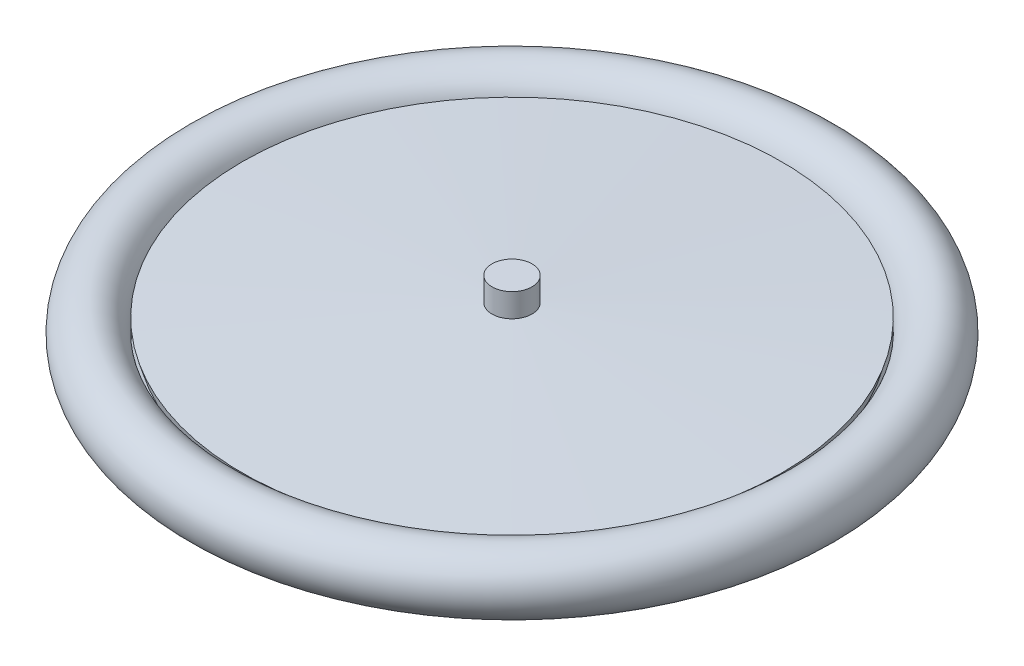
ISO-10303-21;
HEADER;
FILE_DESCRIPTION(('STEP AP214'),'2;1');
FILE_NAME('part.step','',(''),(''),'','','');
FILE_SCHEMA(('AUTOMOTIVE_DESIGN { 1 0 10303 214 1 1 1 1 }'));
ENDSEC;
DATA;
#1=APPLICATION_CONTEXT('core data for automotive mechanical design processes');
#2=APPLICATION_PROTOCOL_DEFINITION('international standard','automotive_design',2000,#1);
#3=PRODUCT_CONTEXT('',#1,'mechanical');
#4=PRODUCT('Part','Part','',(#3));
#5=PRODUCT_RELATED_PRODUCT_CATEGORY('part','',(#4));
#6=PRODUCT_DEFINITION_FORMATION('','',#4);
#7=PRODUCT_DEFINITION_CONTEXT('part definition',#1,'design');
#8=PRODUCT_DEFINITION('design','',#6,#7);
#9=PRODUCT_DEFINITION_SHAPE('','',#8);
#10=(LENGTH_UNIT() NAMED_UNIT(*) SI_UNIT(.MILLI.,.METRE.));
#11=(NAMED_UNIT(*) PLANE_ANGLE_UNIT() SI_UNIT($,.RADIAN.));
#12=(NAMED_UNIT(*) SI_UNIT($,.STERADIAN.) SOLID_ANGLE_UNIT());
#13=UNCERTAINTY_MEASURE_WITH_UNIT(LENGTH_MEASURE(1.E-05),#10,'distance_accuracy_value','');
#14=(GEOMETRIC_REPRESENTATION_CONTEXT(3) GLOBAL_UNCERTAINTY_ASSIGNED_CONTEXT((#13)) GLOBAL_UNIT_ASSIGNED_CONTEXT((#10,
#11,#12)) REPRESENTATION_CONTEXT('',''));
#15=CARTESIAN_POINT('',(0.,0.,0.));
#16=DIRECTION('',(0.,0.,1.));
#17=DIRECTION('',(1.,0.,0.));
#18=AXIS2_PLACEMENT_3D('',#15,#16,#17);
#19=CARTESIAN_POINT('',(0.,25.,0.));
#20=DIRECTION('',(0.,-1.,0.));
#21=DIRECTION('',(1.,0.,0.));
#22=AXIS2_PLACEMENT_3D('',#19,#20,#21);
#23=TOROIDAL_SURFACE('',#22,150.,15.);
#24=CARTESIAN_POINT('',(165.,25.,0.));
#25=VERTEX_POINT('',#24);
#26=VERTEX_LOOP('',#25);
#27=FACE_BOUND('',#26,.T.);
#28=ADVANCED_FACE('F39',(#27),#23,.T.);
#29=CLOSED_SHELL('',(#28));
#30=MANIFOLD_SOLID_BREP('B2',#29);
#31=CARTESIAN_POINT('',(0.,50.,0.));
#32=DIRECTION('',(0.,1.,0.));
#33=DIRECTION('',(-1.,0.,0.));
#34=AXIS2_PLACEMENT_3D('',#31,#32,#33);
#35=PLANE('',#34);
#36=CARTESIAN_POINT('',(0.,50.,0.));
#37=DIRECTION('',(0.,-1.,0.));
#38=DIRECTION('',(1.,0.,0.));
#39=AXIS2_PLACEMENT_3D('',#36,#37,#38);
#40=CIRCLE('',#39,10.);
#41=CARTESIAN_POINT('',(10.,50.,0.));
#42=VERTEX_POINT('',#41);
#43=EDGE_CURVE('E38',#42,#42,#40,.T.);
#44=ORIENTED_EDGE('',*,*,#43,.F.);
#45=EDGE_LOOP('',(#44));
#46=FACE_BOUND('',#45,.T.);
#47=ADVANCED_FACE('F54',(#46),#35,.T.);
#48=CARTESIAN_POINT('',(0.,0.,0.));
#49=DIRECTION('',(0.,-1.,0.));
#50=DIRECTION('',(1.,0.,0.));
#51=AXIS2_PLACEMENT_3D('',#48,#49,#50);
#52=CYLINDRICAL_SURFACE('',#51,10.);
#53=ORIENTED_EDGE('',*,*,#43,.T.);
#54=EDGE_LOOP('',(#53));
#55=FACE_BOUND('',#54,.T.);
#56=CARTESIAN_POINT('',(0.,38.1924821691245,0.));
#57=DIRECTION('',(0.,-1.,0.));
#58=DIRECTION('',(1.,0.,0.));
#59=AXIS2_PLACEMENT_3D('',#56,#57,#58);
#60=CIRCLE('',#59,10.);
#61=CARTESIAN_POINT('',(9.99999999999995,38.1924821691245,0.));
#62=VERTEX_POINT('',#61);
#63=EDGE_CURVE('E60',#62,#62,#60,.T.);
#64=ORIENTED_EDGE('',*,*,#63,.F.);
#65=EDGE_LOOP('',(#64));
#66=FACE_BOUND('',#65,.T.);
#67=ADVANCED_FACE('F99',(#55,#66),#52,.T.);
#68=CARTESIAN_POINT('',(0.,31.7927249202587,0.));
#69=DIRECTION('',(0.,-1.,0.));
#70=DIRECTION('',(1.,0.,0.));
#71=AXIS2_PLACEMENT_3D('',#68,#69,#70);
#72=CONICAL_SURFACE('',#71,135.,1.51964293273203);
#73=CARTESIAN_POINT('',(0.,31.7927249202587,0.));
#74=DIRECTION('',(0.,-1.,0.));
#75=DIRECTION('',(1.,0.,0.));
#76=AXIS2_PLACEMENT_3D('',#73,#74,#75);
#77=CIRCLE('',#76,135.);
#78=CARTESIAN_POINT('',(135.,31.7927249202588,0.));
#79=VERTEX_POINT('',#78);
#80=EDGE_CURVE('E64',#79,#79,#77,.T.);
#81=CARTESIAN_POINT('',(9.99999999999995,38.1924821691245,0.));
#82=CARTESIAN_POINT('',(11.3020833333333,38.1258180311155,0.));
#83=CARTESIAN_POINT('',(12.6041666666666,38.0591538931065,0.));
#84=CARTESIAN_POINT('',(15.2083333333333,37.9258256170884,0.));
#85=CARTESIAN_POINT('',(16.5104166666666,37.8591614790794,0.));
#86=CARTESIAN_POINT('',(19.1145833333333,37.7258332030614,0.));
#87=CARTESIAN_POINT('',(20.4166666666666,37.6591690650524,0.));
#88=CARTESIAN_POINT('',(23.0208333333333,37.5258407890343,0.));
#89=CARTESIAN_POINT('',(24.3229166666666,37.4591766510253,0.));
#90=CARTESIAN_POINT('',(26.9270833333333,37.3258483750073,0.));
#91=CARTESIAN_POINT('',(28.2291666666666,37.2591842369983,0.));
#92=CARTESIAN_POINT('',(30.8333333333333,37.1258559609802,0.));
#93=CARTESIAN_POINT('',(32.1354166666666,37.0591918229712,0.));
#94=CARTESIAN_POINT('',(34.7395833333333,36.9258635469532,0.));
#95=CARTESIAN_POINT('',(36.0416666666666,36.8591994089442,0.));
#96=CARTESIAN_POINT('',(38.6458333333333,36.7258711329261,0.));
#97=CARTESIAN_POINT('',(39.9479166666666,36.6592069949171,0.));
#98=CARTESIAN_POINT('',(42.5520833333333,36.5258787188991,0.));
#99=CARTESIAN_POINT('',(43.8541666666666,36.45921458089,0.));
#100=CARTESIAN_POINT('',(46.4583333333333,36.325886304872,0.));
#101=CARTESIAN_POINT('',(47.7604166666666,36.259222166863,0.));
#102=CARTESIAN_POINT('',(50.3645833333333,36.1258938908449,0.));
#103=CARTESIAN_POINT('',(51.6666666666666,36.0592297528359,0.));
#104=CARTESIAN_POINT('',(54.2708333333333,35.9259014768179,0.));
#105=CARTESIAN_POINT('',(55.5729166666666,35.8592373388089,0.));
#106=CARTESIAN_POINT('',(58.1770833333333,35.7259090627908,0.));
#107=CARTESIAN_POINT('',(59.4791666666666,35.6592449247818,0.));
#108=CARTESIAN_POINT('',(62.0833333333333,35.5259166487638,0.));
#109=CARTESIAN_POINT('',(63.3854166666666,35.4592525107548,0.));
#110=CARTESIAN_POINT('',(65.9895833333333,35.3259242347367,0.));
#111=CARTESIAN_POINT('',(67.2916666666666,35.2592600967277,0.));
#112=CARTESIAN_POINT('',(69.8958333333333,35.1259318207097,0.));
#113=CARTESIAN_POINT('',(71.1979166666666,35.0592676827006,0.));
#114=CARTESIAN_POINT('',(73.8020833333333,34.9259394066826,0.));
#115=CARTESIAN_POINT('',(75.1041666666666,34.8592752686736,0.));
#116=CARTESIAN_POINT('',(77.7083333333333,34.7259469926556,0.));
#117=CARTESIAN_POINT('',(79.0104166666666,34.6592828546465,0.));
#118=CARTESIAN_POINT('',(81.6145833333333,34.5259545786285,0.));
#119=CARTESIAN_POINT('',(82.9166666666666,34.4592904406195,0.));
#120=CARTESIAN_POINT('',(85.5208333333333,34.3259621646015,0.));
#121=CARTESIAN_POINT('',(86.8229166666666,34.2592980265924,0.));
#122=CARTESIAN_POINT('',(89.4270833333333,34.1259697505744,0.));
#123=CARTESIAN_POINT('',(90.7291666666666,34.0593056125654,0.));
#124=CARTESIAN_POINT('',(93.3333333333333,33.9259773365473,0.));
#125=CARTESIAN_POINT('',(94.6354166666666,33.8593131985383,0.));
#126=CARTESIAN_POINT('',(97.2395833333333,33.7259849225203,0.));
#127=CARTESIAN_POINT('',(98.5416666666666,33.6593207845113,0.));
#128=CARTESIAN_POINT('',(101.145833333333,33.5259925084932,0.));
#129=CARTESIAN_POINT('',(102.447916666667,33.4593283704842,0.));
#130=CARTESIAN_POINT('',(105.052083333333,33.3260000944662,0.));
#131=CARTESIAN_POINT('',(106.354166666667,33.2593359564572,0.));
#132=CARTESIAN_POINT('',(108.958333333333,33.1260076804391,0.));
#133=CARTESIAN_POINT('',(110.260416666667,33.0593435424301,0.));
#134=CARTESIAN_POINT('',(112.864583333333,32.9260152664121,0.));
#135=CARTESIAN_POINT('',(114.166666666667,32.859351128403,0.));
#136=CARTESIAN_POINT('',(116.770833333333,32.726022852385,0.));
#137=CARTESIAN_POINT('',(118.072916666667,32.659358714376,0.));
#138=CARTESIAN_POINT('',(120.677083333333,32.526030438358,0.));
#139=CARTESIAN_POINT('',(121.979166666667,32.4593663003489,0.));
#140=CARTESIAN_POINT('',(124.583333333333,32.3260380243309,0.));
#141=CARTESIAN_POINT('',(125.885416666667,32.2593738863219,0.));
#142=CARTESIAN_POINT('',(128.489583333333,32.1260456103039,0.));
#143=CARTESIAN_POINT('',(129.791666666667,32.0593814722948,0.));
#144=CARTESIAN_POINT('',(132.395833333333,31.9260531962768,0.));
#145=CARTESIAN_POINT('',(133.697916666667,31.8593890582678,0.));
#146=CARTESIAN_POINT('',(135.,31.7927249202588,0.));
#147=B_SPLINE_CURVE_WITH_KNOTS('',3,(#81,#82,#83,#84,#85,#86,#87,#88,#89,#90,#91,#92,#93,#94,
#95,#96,#97,#98,#99,#100,#101,#102,#103,#104,#105,#106,#107,#108,#109,#110,#111,#112,#113,#114,
#115,#116,#117,#118,#119,#120,#121,#122,#123,#124,#125,#126,#127,#128,#129,#130,#131,#132,#133,
#134,#135,#136,#137,#138,#139,#140,#141,#142,#143,#144,#145,#146),.UNSPECIFIED.,.F.,.F.,(4,2,2,
2,2,2,2,2,2,2,2,2,2,2,2,2,2,2,2,2,2,2,2,2,2,2,2,2,2,2,2,2,4),(0.,3.91136626106126,
7.82273252212253,11.7340987831838,15.6454650442451,19.5568313053063,23.4681975663676,
27.3795638274289,31.2909300884901,35.2022963495514,39.1136626106126,43.0250288716739,
46.9363951327352,50.8477613937964,54.7591276548577,58.6704939159189,62.5818601769802,
66.4932264380415,70.4045926991027,74.315958960164,78.2273252212253,82.1386914822865,
86.0500577433478,89.9614240044091,93.8727902654704,97.7841565265316,101.695522787593,
105.606889048654,109.518255309715,113.429621570777,117.340987831838,121.252354092899,
125.16372035396),.UNSPECIFIED.);
#148=EDGE_CURVE('BSEAM104',#62,#79,#147,.T.);
#149=ORIENTED_EDGE('',*,*,#63,.T.);
#150=ORIENTED_EDGE('',*,*,#80,.F.);
#151=ORIENTED_EDGE('',*,*,#148,.T.);
#152=ORIENTED_EDGE('',*,*,#148,.F.);
#153=EDGE_LOOP('',(#149,#151,#150,#152));
#154=FACE_BOUND('',#153,.T.);
#155=ADVANCED_FACE('F104',(#154),#72,.T.);
#156=CARTESIAN_POINT('',(0.,25.,0.));
#157=DIRECTION('',(0.,1.,0.));
#158=DIRECTION('',(-1.,0.,0.));
#159=AXIS2_PLACEMENT_3D('',#156,#157,#158);
#160=CONICAL_SURFACE('',#159,133.015042214288,0.28430231831639);
#161=ORIENTED_EDGE('',*,*,#80,.T.);
#162=EDGE_LOOP('',(#161));
#163=FACE_BOUND('',#162,.T.);
#164=CARTESIAN_POINT('',(0.,25.,0.));
#165=DIRECTION('',(0.,-1.,0.));
#166=DIRECTION('',(1.,0.,0.));
#167=AXIS2_PLACEMENT_3D('',#164,#165,#166);
#168=CIRCLE('',#167,133.015042214288);
#169=CARTESIAN_POINT('',(133.015042214288,25.,0.));
#170=VERTEX_POINT('',#169);
#171=EDGE_CURVE('E68',#170,#170,#168,.T.);
#172=ORIENTED_EDGE('',*,*,#171,.F.);
#173=EDGE_LOOP('',(#172));
#174=FACE_BOUND('',#173,.T.);
#175=ADVANCED_FACE('F108',(#163,#174),#160,.T.);
#176=CARTESIAN_POINT('',(0.,18.2072750797413,0.));
#177=DIRECTION('',(0.,-1.,0.));
#178=DIRECTION('',(1.,0.,0.));
#179=AXIS2_PLACEMENT_3D('',#176,#177,#178);
#180=CONICAL_SURFACE('',#179,135.,0.28430231831639);
#181=ORIENTED_EDGE('',*,*,#171,.T.);
#182=EDGE_LOOP('',(#181));
#183=FACE_BOUND('',#182,.T.);
#184=CARTESIAN_POINT('',(0.,18.2072750797413,0.));
#185=DIRECTION('',(0.,-1.,0.));
#186=DIRECTION('',(1.,0.,0.));
#187=AXIS2_PLACEMENT_3D('',#184,#185,#186);
#188=CIRCLE('',#187,135.);
#189=CARTESIAN_POINT('',(-135.,18.2072750797413,0.));
#190=VERTEX_POINT('',#189);
#191=EDGE_CURVE('E73',#190,#190,#188,.T.);
#192=ORIENTED_EDGE('',*,*,#191,.F.);
#193=EDGE_LOOP('',(#192));
#194=FACE_BOUND('',#193,.T.);
#195=ADVANCED_FACE('F95',(#183,#194),#180,.T.);
#196=CARTESIAN_POINT('',(0.,11.8075178308755,0.));
#197=DIRECTION('',(0.,1.,0.));
#198=DIRECTION('',(-1.,0.,0.));
#199=AXIS2_PLACEMENT_3D('',#196,#197,#198);
#200=CONICAL_SURFACE('',#199,10.,1.51964293273203);
#201=CARTESIAN_POINT('',(0.,11.8075178308755,0.));
#202=DIRECTION('',(0.,-1.,0.));
#203=DIRECTION('',(1.,0.,0.));
#204=AXIS2_PLACEMENT_3D('',#201,#202,#203);
#205=CIRCLE('',#204,10.);
#206=CARTESIAN_POINT('',(-10.,11.8075178308755,0.));
#207=VERTEX_POINT('',#206);
#208=EDGE_CURVE('E76',#207,#207,#205,.T.);
#209=CARTESIAN_POINT('',(-135.,18.2072750797413,0.));
#210=CARTESIAN_POINT('',(-133.697916666667,18.1406109417322,0.));
#211=CARTESIAN_POINT('',(-132.395833333333,18.0739468037232,0.));
#212=CARTESIAN_POINT('',(-129.791666666667,17.9406185277052,0.));
#213=CARTESIAN_POINT('',(-128.489583333333,17.8739543896962,0.));
#214=CARTESIAN_POINT('',(-125.885416666667,17.7406261136781,0.));
#215=CARTESIAN_POINT('',(-124.583333333333,17.6739619756691,0.));
#216=CARTESIAN_POINT('',(-121.979166666667,17.5406336996511,0.));
#217=CARTESIAN_POINT('',(-120.677083333333,17.4739695616421,0.));
#218=CARTESIAN_POINT('',(-118.072916666667,17.340641285624,0.));
#219=CARTESIAN_POINT('',(-116.770833333333,17.273977147615,0.));
#220=CARTESIAN_POINT('',(-114.166666666667,17.140648871597,0.));
#221=CARTESIAN_POINT('',(-112.864583333333,17.073984733588,0.));
#222=CARTESIAN_POINT('',(-110.260416666667,16.9406564575699,0.));
#223=CARTESIAN_POINT('',(-108.958333333333,16.8739923195609,0.));
#224=CARTESIAN_POINT('',(-106.354166666667,16.7406640435429,0.));
#225=CARTESIAN_POINT('',(-105.052083333333,16.6739999055338,0.));
#226=CARTESIAN_POINT('',(-102.447916666667,16.5406716295158,0.));
#227=CARTESIAN_POINT('',(-101.145833333333,16.4740074915068,0.));
#228=CARTESIAN_POINT('',(-98.5416666666667,16.3406792154888,0.));
#229=CARTESIAN_POINT('',(-97.2395833333333,16.2740150774797,0.));
#230=CARTESIAN_POINT('',(-94.6354166666667,16.1406868014617,0.));
#231=CARTESIAN_POINT('',(-93.3333333333333,16.0740226634527,0.));
#232=CARTESIAN_POINT('',(-90.7291666666667,15.9406943874346,0.));
#233=CARTESIAN_POINT('',(-89.4270833333333,15.8740302494256,0.));
#234=CARTESIAN_POINT('',(-86.8229166666667,15.7407019734076,0.));
#235=CARTESIAN_POINT('',(-85.5208333333333,15.6740378353986,0.));
#236=CARTESIAN_POINT('',(-82.9166666666667,15.5407095593805,0.));
#237=CARTESIAN_POINT('',(-81.6145833333333,15.4740454213715,0.));
#238=CARTESIAN_POINT('',(-79.0104166666667,15.3407171453535,0.));
#239=CARTESIAN_POINT('',(-77.7083333333333,15.2740530073445,0.));
#240=CARTESIAN_POINT('',(-75.1041666666667,15.1407247313264,0.));
#241=CARTESIAN_POINT('',(-73.8020833333333,15.0740605933174,0.));
#242=CARTESIAN_POINT('',(-71.1979166666667,14.9407323172994,0.));
#243=CARTESIAN_POINT('',(-69.8958333333333,14.8740681792904,0.));
#244=CARTESIAN_POINT('',(-67.2916666666667,14.7407399032723,0.));
#245=CARTESIAN_POINT('',(-65.9895833333333,14.6740757652633,0.));
#246=CARTESIAN_POINT('',(-63.3854166666667,14.5407474892453,0.));
#247=CARTESIAN_POINT('',(-62.0833333333333,14.4740833512362,0.));
#248=CARTESIAN_POINT('',(-59.4791666666667,14.3407550752182,0.));
#249=CARTESIAN_POINT('',(-58.1770833333333,14.2740909372092,0.));
#250=CARTESIAN_POINT('',(-55.5729166666667,14.1407626611912,0.));
#251=CARTESIAN_POINT('',(-54.2708333333333,14.0740985231821,0.));
#252=CARTESIAN_POINT('',(-51.6666666666667,13.9407702471641,0.));
#253=CARTESIAN_POINT('',(-50.3645833333333,13.8741061091551,0.));
#254=CARTESIAN_POINT('',(-47.7604166666667,13.740777833137,0.));
#255=CARTESIAN_POINT('',(-46.4583333333333,13.674113695128,0.));
#256=CARTESIAN_POINT('',(-43.8541666666667,13.54078541911,0.));
#257=CARTESIAN_POINT('',(-42.5520833333333,13.474121281101,0.));
#258=CARTESIAN_POINT('',(-39.9479166666667,13.3407930050829,0.));
#259=CARTESIAN_POINT('',(-38.6458333333333,13.2741288670739,0.));
#260=CARTESIAN_POINT('',(-36.0416666666667,13.1408005910559,0.));
#261=CARTESIAN_POINT('',(-34.7395833333333,13.0741364530469,0.));
#262=CARTESIAN_POINT('',(-32.1354166666667,12.9408081770288,0.));
#263=CARTESIAN_POINT('',(-30.8333333333333,12.8741440390198,0.));
#264=CARTESIAN_POINT('',(-28.2291666666667,12.7408157630018,0.));
#265=CARTESIAN_POINT('',(-26.9270833333333,12.6741516249928,0.));
#266=CARTESIAN_POINT('',(-24.3229166666667,12.5408233489747,0.));
#267=CARTESIAN_POINT('',(-23.0208333333333,12.4741592109657,0.));
#268=CARTESIAN_POINT('',(-20.4166666666667,12.3408309349477,0.));
#269=CARTESIAN_POINT('',(-19.1145833333333,12.2741667969386,0.));
#270=CARTESIAN_POINT('',(-16.5104166666667,12.1408385209206,0.));
#271=CARTESIAN_POINT('',(-15.2083333333333,12.0741743829116,0.));
#272=CARTESIAN_POINT('',(-12.6041666666667,11.9408461068936,0.));
#273=CARTESIAN_POINT('',(-11.3020833333334,11.8741819688845,0.));
#274=CARTESIAN_POINT('',(-10.,11.8075178308755,0.));
#275=B_SPLINE_CURVE_WITH_KNOTS('',3,(#209,#210,#211,#212,#213,#214,#215,#216,#217,#218,#219,
#220,#221,#222,#223,#224,#225,#226,#227,#228,#229,#230,#231,#232,#233,#234,#235,#236,#237,#238,
#239,#240,#241,#242,#243,#244,#245,#246,#247,#248,#249,#250,#251,#252,#253,#254,#255,#256,#257,
#258,#259,#260,#261,#262,#263,#264,#265,#266,#267,#268,#269,#270,#271,#272,#273,#274),
.UNSPECIFIED.,.F.,.F.,(4,2,2,2,2,2,2,2,2,2,2,2,2,2,2,2,2,2,2,2,2,2,2,2,2,2,2,2,2,2,2,2,4),(0.,
3.91136626106126,7.82273252212253,11.7340987831838,15.6454650442451,19.5568313053063,
23.4681975663676,27.3795638274288,31.2909300884901,35.2022963495513,39.1136626106126,
43.0250288716739,46.9363951327352,50.8477613937964,54.7591276548577,58.6704939159189,
62.5818601769802,66.4932264380414,70.4045926991027,74.315958960164,78.2273252212252,
82.1386914822865,86.0500577433478,89.9614240044091,93.8727902654703,97.7841565265316,
101.695522787593,105.606889048654,109.518255309715,113.429621570777,117.340987831838,
121.252354092899,125.16372035396),.UNSPECIFIED.);
#276=EDGE_CURVE('BSEAM87',#190,#207,#275,.T.);
#277=ORIENTED_EDGE('',*,*,#191,.T.);
#278=ORIENTED_EDGE('',*,*,#208,.F.);
#279=ORIENTED_EDGE('',*,*,#276,.T.);
#280=ORIENTED_EDGE('',*,*,#276,.F.);
#281=EDGE_LOOP('',(#277,#279,#278,#280));
#282=FACE_BOUND('',#281,.T.);
#283=ADVANCED_FACE('F87',(#282),#200,.T.);
#284=CARTESIAN_POINT('',(0.,0.,0.));
#285=DIRECTION('',(0.,-1.,0.));
#286=DIRECTION('',(1.,0.,0.));
#287=AXIS2_PLACEMENT_3D('',#284,#285,#286);
#288=CYLINDRICAL_SURFACE('',#287,10.);
#289=ORIENTED_EDGE('',*,*,#208,.T.);
#290=EDGE_LOOP('',(#289));
#291=FACE_BOUND('',#290,.T.);
#292=CARTESIAN_POINT('',(0.,0.,0.));
#293=DIRECTION('',(0.,-1.,0.));
#294=DIRECTION('',(1.,0.,0.));
#295=AXIS2_PLACEMENT_3D('',#292,#293,#294);
#296=CIRCLE('',#295,10.);
#297=CARTESIAN_POINT('',(10.,0.,0.));
#298=VERTEX_POINT('',#297);
#299=EDGE_CURVE('E79',#298,#298,#296,.T.);
#300=ORIENTED_EDGE('',*,*,#299,.F.);
#301=EDGE_LOOP('',(#300));
#302=FACE_BOUND('',#301,.T.);
#303=ADVANCED_FACE('F85',(#291,#302),#288,.T.);
#304=CARTESIAN_POINT('',(0.,0.,0.));
#305=DIRECTION('',(0.,-1.,0.));
#306=DIRECTION('',(1.,0.,0.));
#307=AXIS2_PLACEMENT_3D('',#304,#305,#306);
#308=PLANE('',#307);
#309=ORIENTED_EDGE('',*,*,#299,.T.);
#310=EDGE_LOOP('',(#309));
#311=FACE_BOUND('',#310,.T.);
#312=ADVANCED_FACE('F83',(#311),#308,.T.);
#313=CLOSED_SHELL('',(#47,#67,#155,#175,#195,#283,#303,#312));
#314=MANIFOLD_SOLID_BREP('B6',#313);
#315=ADVANCED_BREP_SHAPE_REPRESENTATION('',(#18,#30,#314),#14);
#316=SHAPE_DEFINITION_REPRESENTATION(#9,#315);
ENDSEC;
END-ISO-10303-21;
